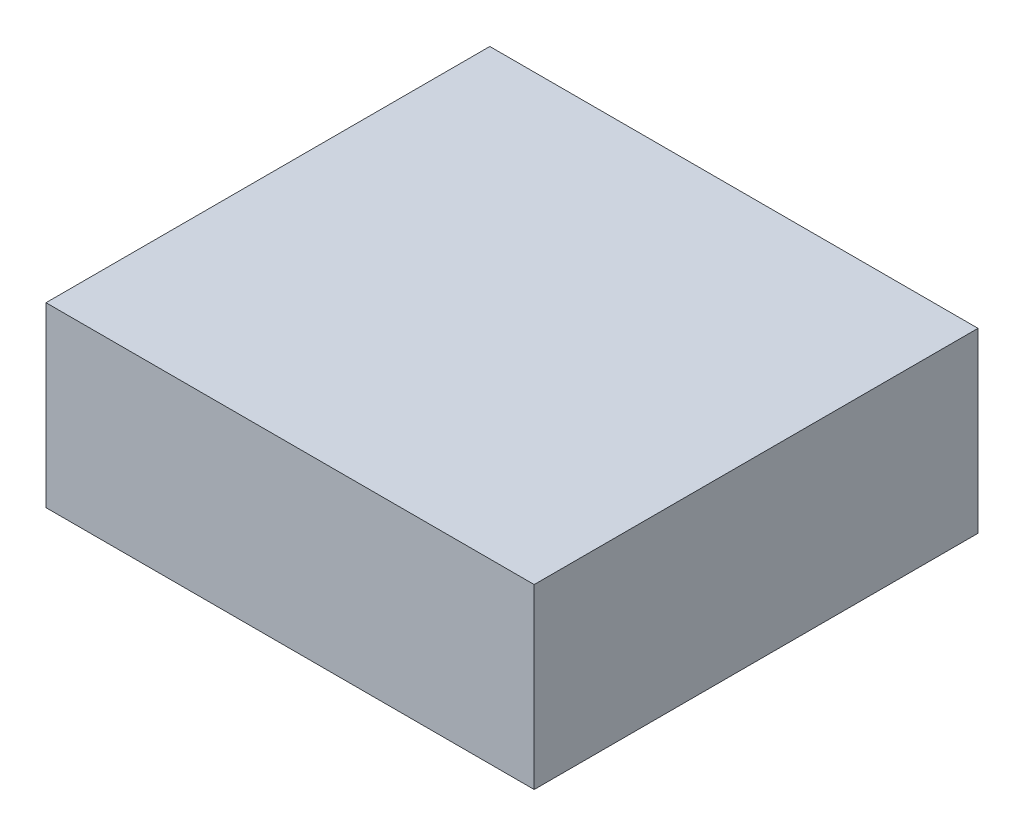
ISO-10303-21;
HEADER;
FILE_DESCRIPTION(('STEP AP214'),'2;1');
FILE_NAME('part.step','',(''),(''),'','','');
FILE_SCHEMA(('AUTOMOTIVE_DESIGN { 1 0 10303 214 1 1 1 1 }'));
ENDSEC;
DATA;
#1=APPLICATION_CONTEXT('core data for automotive mechanical design processes');
#2=APPLICATION_PROTOCOL_DEFINITION('international standard','automotive_design',2000,#1);
#3=PRODUCT_CONTEXT('',#1,'mechanical');
#4=PRODUCT('Part','Part','',(#3));
#5=PRODUCT_RELATED_PRODUCT_CATEGORY('part','',(#4));
#6=PRODUCT_DEFINITION_FORMATION('','',#4);
#7=PRODUCT_DEFINITION_CONTEXT('part definition',#1,'design');
#8=PRODUCT_DEFINITION('design','',#6,#7);
#9=PRODUCT_DEFINITION_SHAPE('','',#8);
#10=(LENGTH_UNIT() NAMED_UNIT(*) SI_UNIT(.MILLI.,.METRE.));
#11=(NAMED_UNIT(*) PLANE_ANGLE_UNIT() SI_UNIT($,.RADIAN.));
#12=(NAMED_UNIT(*) SI_UNIT($,.STERADIAN.) SOLID_ANGLE_UNIT());
#13=UNCERTAINTY_MEASURE_WITH_UNIT(LENGTH_MEASURE(1.E-05),#10,'distance_accuracy_value','');
#14=(GEOMETRIC_REPRESENTATION_CONTEXT(3) GLOBAL_UNCERTAINTY_ASSIGNED_CONTEXT((#13)) GLOBAL_UNIT_ASSIGNED_CONTEXT((#10,
#11,#12)) REPRESENTATION_CONTEXT('',''));
#15=CARTESIAN_POINT('',(0.,0.,0.));
#16=DIRECTION('',(0.,0.,1.));
#17=DIRECTION('',(1.,0.,0.));
#18=AXIS2_PLACEMENT_3D('',#15,#16,#17);
#19=CARTESIAN_POINT('',(-69.85,50.8,-63.5));
#20=DIRECTION('',(1.,0.,0.));
#21=DIRECTION('',(0.,0.,-1.));
#22=AXIS2_PLACEMENT_3D('',#19,#20,#21);
#23=PLANE('',#22);
#24=DIRECTION('',(0.,0.,1.));
#25=VECTOR('',#24,1.);
#26=CARTESIAN_POINT('',(-69.85,0.,-63.5));
#27=LINE('',#26,#25);
#28=CARTESIAN_POINT('',(-69.85,0.,-63.5));
#29=VERTEX_POINT('',#28);
#30=CARTESIAN_POINT('',(-69.85,0.,63.5));
#31=VERTEX_POINT('',#30);
#32=EDGE_CURVE('E96',#29,#31,#27,.T.);
#33=ORIENTED_EDGE('',*,*,#32,.T.);
#34=DIRECTION('',(0.,-1.,0.));
#35=VECTOR('',#34,1.);
#36=CARTESIAN_POINT('',(-69.85,50.8,63.5));
#37=LINE('',#36,#35);
#38=CARTESIAN_POINT('',(-69.85,50.8,63.5));
#39=VERTEX_POINT('',#38);
#40=EDGE_CURVE('E11',#39,#31,#37,.T.);
#41=ORIENTED_EDGE('',*,*,#40,.F.);
#42=DIRECTION('',(0.,0.,1.));
#43=VECTOR('',#42,1.);
#44=CARTESIAN_POINT('',(-69.85,50.8,-63.5));
#45=LINE('',#44,#43);
#46=CARTESIAN_POINT('',(-69.85,50.8,-63.5));
#47=VERTEX_POINT('',#46);
#48=EDGE_CURVE('E84',#47,#39,#45,.T.);
#49=ORIENTED_EDGE('',*,*,#48,.F.);
#50=DIRECTION('',(0.,-1.,0.));
#51=VECTOR('',#50,1.);
#52=CARTESIAN_POINT('',(-69.85,50.8,-63.5));
#53=LINE('',#52,#51);
#54=EDGE_CURVE('E92',#47,#29,#53,.T.);
#55=ORIENTED_EDGE('',*,*,#54,.T.);
#56=EDGE_LOOP('',(#33,#41,#49,#55));
#57=FACE_BOUND('',#56,.T.);
#58=ADVANCED_FACE('F33',(#57),#23,.F.);
#59=CARTESIAN_POINT('',(-69.85,50.8,63.5));
#60=DIRECTION('',(0.,0.,-1.));
#61=DIRECTION('',(-1.,0.,0.));
#62=AXIS2_PLACEMENT_3D('',#59,#60,#61);
#63=PLANE('',#62);
#64=DIRECTION('',(1.,0.,0.));
#65=VECTOR('',#64,1.);
#66=CARTESIAN_POINT('',(-69.85,0.,63.5));
#67=LINE('',#66,#65);
#68=CARTESIAN_POINT('',(69.85,0.,63.5));
#69=VERTEX_POINT('',#68);
#70=EDGE_CURVE('E88',#31,#69,#67,.T.);
#71=ORIENTED_EDGE('',*,*,#70,.T.);
#72=DIRECTION('',(0.,-1.,0.));
#73=VECTOR('',#72,1.);
#74=CARTESIAN_POINT('',(69.85,50.8,63.5));
#75=LINE('',#74,#73);
#76=CARTESIAN_POINT('',(69.85,50.8,63.5));
#77=VERTEX_POINT('',#76);
#78=EDGE_CURVE('E41',#77,#69,#75,.T.);
#79=ORIENTED_EDGE('',*,*,#78,.F.);
#80=DIRECTION('',(1.,0.,0.));
#81=VECTOR('',#80,1.);
#82=CARTESIAN_POINT('',(-69.85,50.8,63.5));
#83=LINE('',#82,#81);
#84=EDGE_CURVE('E79',#39,#77,#83,.T.);
#85=ORIENTED_EDGE('',*,*,#84,.F.);
#86=ORIENTED_EDGE('',*,*,#40,.T.);
#87=EDGE_LOOP('',(#71,#79,#85,#86));
#88=FACE_BOUND('',#87,.T.);
#89=ADVANCED_FACE('F87',(#88),#63,.F.);
#90=CARTESIAN_POINT('',(69.85,50.8,-63.5));
#91=DIRECTION('',(-1.,0.,0.));
#92=DIRECTION('',(0.,0.,1.));
#93=AXIS2_PLACEMENT_3D('',#90,#91,#92);
#94=PLANE('',#93);
#95=DIRECTION('',(0.,0.,-1.));
#96=VECTOR('',#95,1.);
#97=CARTESIAN_POINT('',(69.85,0.,-63.5));
#98=LINE('',#97,#96);
#99=CARTESIAN_POINT('',(69.85,0.,-63.5));
#100=VERTEX_POINT('',#99);
#101=EDGE_CURVE('E66',#69,#100,#98,.T.);
#102=ORIENTED_EDGE('',*,*,#101,.T.);
#103=DIRECTION('',(0.,-1.,0.));
#104=VECTOR('',#103,1.);
#105=CARTESIAN_POINT('',(69.85,50.8,-63.5));
#106=LINE('',#105,#104);
#107=CARTESIAN_POINT('',(69.85,50.8,-63.5));
#108=VERTEX_POINT('',#107);
#109=EDGE_CURVE('E89',#108,#100,#106,.T.);
#110=ORIENTED_EDGE('',*,*,#109,.F.);
#111=DIRECTION('',(0.,0.,-1.));
#112=VECTOR('',#111,1.);
#113=CARTESIAN_POINT('',(69.85,50.8,-63.5));
#114=LINE('',#113,#112);
#115=EDGE_CURVE('E82',#77,#108,#114,.T.);
#116=ORIENTED_EDGE('',*,*,#115,.F.);
#117=ORIENTED_EDGE('',*,*,#78,.T.);
#118=EDGE_LOOP('',(#102,#110,#116,#117));
#119=FACE_BOUND('',#118,.T.);
#120=ADVANCED_FACE('F90',(#119),#94,.F.);
#121=CARTESIAN_POINT('',(-69.85,50.8,-63.5));
#122=DIRECTION('',(0.,0.,1.));
#123=DIRECTION('',(1.,0.,0.));
#124=AXIS2_PLACEMENT_3D('',#121,#122,#123);
#125=PLANE('',#124);
#126=DIRECTION('',(-1.,0.,0.));
#127=VECTOR('',#126,1.);
#128=CARTESIAN_POINT('',(-69.85,0.,-63.5));
#129=LINE('',#128,#127);
#130=EDGE_CURVE('E72',#100,#29,#129,.T.);
#131=ORIENTED_EDGE('',*,*,#130,.T.);
#132=ORIENTED_EDGE('',*,*,#54,.F.);
#133=DIRECTION('',(-1.,0.,0.));
#134=VECTOR('',#133,1.);
#135=CARTESIAN_POINT('',(-69.85,50.8,-63.5));
#136=LINE('',#135,#134);
#137=EDGE_CURVE('E49',#108,#47,#136,.T.);
#138=ORIENTED_EDGE('',*,*,#137,.F.);
#139=ORIENTED_EDGE('',*,*,#109,.T.);
#140=EDGE_LOOP('',(#131,#132,#138,#139));
#141=FACE_BOUND('',#140,.T.);
#142=ADVANCED_FACE('F103',(#141),#125,.F.);
#143=CARTESIAN_POINT('',(0.,50.8,0.));
#144=DIRECTION('',(0.,1.,0.));
#145=DIRECTION('',(0.,0.,1.));
#146=AXIS2_PLACEMENT_3D('',#143,#144,#145);
#147=PLANE('',#146);
#148=ORIENTED_EDGE('',*,*,#48,.T.);
#149=ORIENTED_EDGE('',*,*,#84,.T.);
#150=ORIENTED_EDGE('',*,*,#115,.T.);
#151=ORIENTED_EDGE('',*,*,#137,.T.);
#152=EDGE_LOOP('',(#148,#149,#150,#151));
#153=FACE_BOUND('',#152,.T.);
#154=ADVANCED_FACE('F80',(#153),#147,.T.);
#155=CARTESIAN_POINT('',(0.,0.,0.));
#156=DIRECTION('',(0.,1.,0.));
#157=DIRECTION('',(0.,0.,1.));
#158=AXIS2_PLACEMENT_3D('',#155,#156,#157);
#159=PLANE('',#158);
#160=ORIENTED_EDGE('',*,*,#32,.F.);
#161=ORIENTED_EDGE('',*,*,#130,.F.);
#162=ORIENTED_EDGE('',*,*,#101,.F.);
#163=ORIENTED_EDGE('',*,*,#70,.F.);
#164=EDGE_LOOP('',(#160,#161,#162,#163));
#165=FACE_BOUND('',#164,.T.);
#166=ADVANCED_FACE('F106',(#165),#159,.F.);
#167=CLOSED_SHELL('',(#58,#89,#120,#142,#154,#166));
#168=MANIFOLD_SOLID_BREP('B2',#167);
#169=ADVANCED_BREP_SHAPE_REPRESENTATION('',(#18,#168),#14);
#170=SHAPE_DEFINITION_REPRESENTATION(#9,#169);
ENDSEC;
END-ISO-10303-21;
